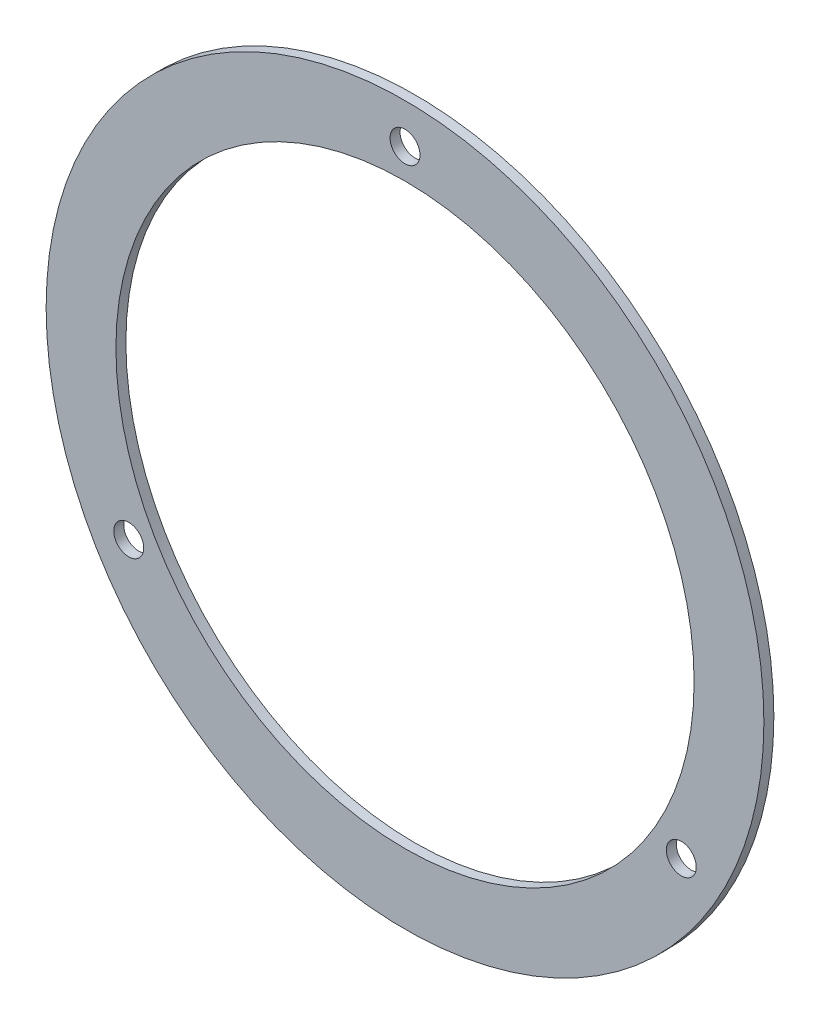
ISO-10303-21;
HEADER;
FILE_DESCRIPTION(('STEP AP214'),'2;1');
FILE_NAME('part.step','',(''),(''),'','','');
FILE_SCHEMA(('AUTOMOTIVE_DESIGN { 1 0 10303 214 1 1 1 1 }'));
ENDSEC;
DATA;
#1=APPLICATION_CONTEXT('core data for automotive mechanical design processes');
#2=APPLICATION_PROTOCOL_DEFINITION('international standard','automotive_design',2000,#1);
#3=PRODUCT_CONTEXT('',#1,'mechanical');
#4=PRODUCT('Part','Part','',(#3));
#5=PRODUCT_RELATED_PRODUCT_CATEGORY('part','',(#4));
#6=PRODUCT_DEFINITION_FORMATION('','',#4);
#7=PRODUCT_DEFINITION_CONTEXT('part definition',#1,'design');
#8=PRODUCT_DEFINITION('design','',#6,#7);
#9=PRODUCT_DEFINITION_SHAPE('','',#8);
#10=(LENGTH_UNIT() NAMED_UNIT(*) SI_UNIT(.MILLI.,.METRE.));
#11=(NAMED_UNIT(*) PLANE_ANGLE_UNIT() SI_UNIT($,.RADIAN.));
#12=(NAMED_UNIT(*) SI_UNIT($,.STERADIAN.) SOLID_ANGLE_UNIT());
#13=UNCERTAINTY_MEASURE_WITH_UNIT(LENGTH_MEASURE(1.E-05),#10,'distance_accuracy_value','');
#14=(GEOMETRIC_REPRESENTATION_CONTEXT(3) GLOBAL_UNCERTAINTY_ASSIGNED_CONTEXT((#13)) GLOBAL_UNIT_ASSIGNED_CONTEXT((#10,
#11,#12)) REPRESENTATION_CONTEXT('',''));
#15=CARTESIAN_POINT('',(0.,0.,0.));
#16=DIRECTION('',(0.,0.,1.));
#17=DIRECTION('',(1.,0.,0.));
#18=AXIS2_PLACEMENT_3D('',#15,#16,#17);
#19=CARTESIAN_POINT('',(0.,0.,1.));
#20=DIRECTION('',(0.,0.,1.));
#21=DIRECTION('',(1.,0.,0.));
#22=AXIS2_PLACEMENT_3D('',#19,#20,#21);
#23=PLANE('',#22);
#24=CARTESIAN_POINT('',(27.7128129211019,-16.,1.));
#25=DIRECTION('',(0.,0.,1.));
#26=DIRECTION('',(1.,0.,0.));
#27=AXIS2_PLACEMENT_3D('',#24,#25,#26);
#28=CIRCLE('',#27,1.5);
#29=CARTESIAN_POINT('',(29.212812921102,-16.,1.));
#30=VERTEX_POINT('',#29);
#31=EDGE_CURVE('E37',#30,#30,#28,.T.);
#32=ORIENTED_EDGE('',*,*,#31,.F.);
#33=EDGE_LOOP('',(#32));
#34=FACE_BOUND('',#33,.T.);
#35=CARTESIAN_POINT('',(0.,0.,1.));
#36=DIRECTION('',(0.,0.,1.));
#37=DIRECTION('',(1.,0.,0.));
#38=AXIS2_PLACEMENT_3D('',#35,#36,#37);
#39=CIRCLE('',#38,29.);
#40=CARTESIAN_POINT('',(29.,0.,1.));
#41=VERTEX_POINT('',#40);
#42=EDGE_CURVE('E26',#41,#41,#39,.T.);
#43=ORIENTED_EDGE('',*,*,#42,.F.);
#44=EDGE_LOOP('',(#43));
#45=FACE_BOUND('',#44,.T.);
#46=CARTESIAN_POINT('',(0.,0.,1.));
#47=DIRECTION('',(0.,0.,1.));
#48=DIRECTION('',(1.,0.,0.));
#49=AXIS2_PLACEMENT_3D('',#46,#47,#48);
#50=CIRCLE('',#49,36.);
#51=CARTESIAN_POINT('',(36.,0.,1.));
#52=VERTEX_POINT('',#51);
#53=EDGE_CURVE('E10',#52,#52,#50,.T.);
#54=ORIENTED_EDGE('',*,*,#53,.T.);
#55=EDGE_LOOP('',(#54));
#56=FACE_BOUND('',#55,.T.);
#57=CARTESIAN_POINT('',(0.,32.,1.));
#58=DIRECTION('',(0.,0.,1.));
#59=DIRECTION('',(1.,0.,0.));
#60=AXIS2_PLACEMENT_3D('',#57,#58,#59);
#61=CIRCLE('',#60,1.5);
#62=CARTESIAN_POINT('',(1.5,32.,1.));
#63=VERTEX_POINT('',#62);
#64=EDGE_CURVE('E31',#63,#63,#61,.T.);
#65=ORIENTED_EDGE('',*,*,#64,.F.);
#66=EDGE_LOOP('',(#65));
#67=FACE_BOUND('',#66,.T.);
#68=CARTESIAN_POINT('',(-27.7128129211019,-16.,1.));
#69=DIRECTION('',(0.,0.,1.));
#70=DIRECTION('',(1.,0.,0.));
#71=AXIS2_PLACEMENT_3D('',#68,#69,#70);
#72=CIRCLE('',#71,1.5);
#73=CARTESIAN_POINT('',(-26.2128129211019,-16.,1.));
#74=VERTEX_POINT('',#73);
#75=EDGE_CURVE('E43',#74,#74,#72,.T.);
#76=ORIENTED_EDGE('',*,*,#75,.F.);
#77=EDGE_LOOP('',(#76));
#78=FACE_BOUND('',#77,.T.);
#79=ADVANCED_FACE('F15',(#34,#45,#56,#67,#78),#23,.T.);
#80=CARTESIAN_POINT('',(0.,0.,0.));
#81=DIRECTION('',(0.,0.,1.));
#82=DIRECTION('',(1.,0.,0.));
#83=AXIS2_PLACEMENT_3D('',#80,#81,#82);
#84=PLANE('',#83);
#85=CARTESIAN_POINT('',(0.,0.,0.));
#86=DIRECTION('',(0.,0.,1.));
#87=DIRECTION('',(1.,0.,0.));
#88=AXIS2_PLACEMENT_3D('',#85,#86,#87);
#89=CIRCLE('',#88,36.);
#90=CARTESIAN_POINT('',(36.,0.,0.));
#91=VERTEX_POINT('',#90);
#92=EDGE_CURVE('E19',#91,#91,#89,.T.);
#93=ORIENTED_EDGE('',*,*,#92,.F.);
#94=EDGE_LOOP('',(#93));
#95=FACE_BOUND('',#94,.T.);
#96=CARTESIAN_POINT('',(0.,0.,0.));
#97=DIRECTION('',(0.,0.,1.));
#98=DIRECTION('',(1.,0.,0.));
#99=AXIS2_PLACEMENT_3D('',#96,#97,#98);
#100=CIRCLE('',#99,29.);
#101=CARTESIAN_POINT('',(29.,0.,0.));
#102=VERTEX_POINT('',#101);
#103=EDGE_CURVE('E28',#102,#102,#100,.T.);
#104=ORIENTED_EDGE('',*,*,#103,.T.);
#105=EDGE_LOOP('',(#104));
#106=FACE_BOUND('',#105,.T.);
#107=CARTESIAN_POINT('',(0.,32.,0.));
#108=DIRECTION('',(0.,0.,1.));
#109=DIRECTION('',(1.,0.,0.));
#110=AXIS2_PLACEMENT_3D('',#107,#108,#109);
#111=CIRCLE('',#110,1.5);
#112=CARTESIAN_POINT('',(1.5,32.,0.));
#113=VERTEX_POINT('',#112);
#114=EDGE_CURVE('E34',#113,#113,#111,.T.);
#115=ORIENTED_EDGE('',*,*,#114,.T.);
#116=EDGE_LOOP('',(#115));
#117=FACE_BOUND('',#116,.T.);
#118=CARTESIAN_POINT('',(27.7128129211019,-16.,0.));
#119=DIRECTION('',(0.,0.,1.));
#120=DIRECTION('',(1.,0.,0.));
#121=AXIS2_PLACEMENT_3D('',#118,#119,#120);
#122=CIRCLE('',#121,1.5);
#123=CARTESIAN_POINT('',(29.212812921102,-16.,0.));
#124=VERTEX_POINT('',#123);
#125=EDGE_CURVE('E40',#124,#124,#122,.T.);
#126=ORIENTED_EDGE('',*,*,#125,.T.);
#127=EDGE_LOOP('',(#126));
#128=FACE_BOUND('',#127,.T.);
#129=CARTESIAN_POINT('',(-27.7128129211019,-16.,0.));
#130=DIRECTION('',(0.,0.,1.));
#131=DIRECTION('',(1.,0.,0.));
#132=AXIS2_PLACEMENT_3D('',#129,#130,#131);
#133=CIRCLE('',#132,1.5);
#134=CARTESIAN_POINT('',(-26.2128129211019,-16.,0.));
#135=VERTEX_POINT('',#134);
#136=EDGE_CURVE('E46',#135,#135,#133,.T.);
#137=ORIENTED_EDGE('',*,*,#136,.T.);
#138=EDGE_LOOP('',(#137));
#139=FACE_BOUND('',#138,.T.);
#140=ADVANCED_FACE('F56',(#95,#106,#117,#128,#139),#84,.F.);
#141=CARTESIAN_POINT('',(0.,0.,1.));
#142=DIRECTION('',(0.,0.,-1.));
#143=DIRECTION('',(-1.,0.,0.));
#144=AXIS2_PLACEMENT_3D('',#141,#142,#143);
#145=CYLINDRICAL_SURFACE('',#144,36.);
#146=ORIENTED_EDGE('',*,*,#53,.F.);
#147=EDGE_LOOP('',(#146));
#148=FACE_BOUND('',#147,.T.);
#149=ORIENTED_EDGE('',*,*,#92,.T.);
#150=EDGE_LOOP('',(#149));
#151=FACE_BOUND('',#150,.T.);
#152=ADVANCED_FACE('F17',(#148,#151),#145,.T.);
#153=CARTESIAN_POINT('',(0.,0.,1.));
#154=DIRECTION('',(0.,0.,-1.));
#155=DIRECTION('',(-1.,0.,0.));
#156=AXIS2_PLACEMENT_3D('',#153,#154,#155);
#157=CYLINDRICAL_SURFACE('',#156,29.);
#158=ORIENTED_EDGE('',*,*,#42,.T.);
#159=EDGE_LOOP('',(#158));
#160=FACE_BOUND('',#159,.T.);
#161=ORIENTED_EDGE('',*,*,#103,.F.);
#162=EDGE_LOOP('',(#161));
#163=FACE_BOUND('',#162,.T.);
#164=ADVANCED_FACE('F68',(#160,#163),#157,.F.);
#165=CARTESIAN_POINT('',(0.,32.,1.));
#166=DIRECTION('',(0.,0.,-1.));
#167=DIRECTION('',(-1.,0.,0.));
#168=AXIS2_PLACEMENT_3D('',#165,#166,#167);
#169=CYLINDRICAL_SURFACE('',#168,1.5);
#170=ORIENTED_EDGE('',*,*,#64,.T.);
#171=EDGE_LOOP('',(#170));
#172=FACE_BOUND('',#171,.T.);
#173=ORIENTED_EDGE('',*,*,#114,.F.);
#174=EDGE_LOOP('',(#173));
#175=FACE_BOUND('',#174,.T.);
#176=ADVANCED_FACE('F71',(#172,#175),#169,.F.);
#177=CARTESIAN_POINT('',(27.7128129211019,-16.,1.));
#178=DIRECTION('',(0.,0.,-1.));
#179=DIRECTION('',(-1.,0.,0.));
#180=AXIS2_PLACEMENT_3D('',#177,#178,#179);
#181=CYLINDRICAL_SURFACE('',#180,1.5);
#182=ORIENTED_EDGE('',*,*,#31,.T.);
#183=EDGE_LOOP('',(#182));
#184=FACE_BOUND('',#183,.T.);
#185=ORIENTED_EDGE('',*,*,#125,.F.);
#186=EDGE_LOOP('',(#185));
#187=FACE_BOUND('',#186,.T.);
#188=ADVANCED_FACE('F75',(#184,#187),#181,.F.);
#189=CARTESIAN_POINT('',(-27.7128129211019,-16.,1.));
#190=DIRECTION('',(0.,0.,-1.));
#191=DIRECTION('',(-1.,0.,0.));
#192=AXIS2_PLACEMENT_3D('',#189,#190,#191);
#193=CYLINDRICAL_SURFACE('',#192,1.5);
#194=ORIENTED_EDGE('',*,*,#75,.T.);
#195=EDGE_LOOP('',(#194));
#196=FACE_BOUND('',#195,.T.);
#197=ORIENTED_EDGE('',*,*,#136,.F.);
#198=EDGE_LOOP('',(#197));
#199=FACE_BOUND('',#198,.T.);
#200=ADVANCED_FACE('F52',(#196,#199),#193,.F.);
#201=CLOSED_SHELL('',(#79,#140,#152,#164,#176,#188,#200));
#202=MANIFOLD_SOLID_BREP('B1',#201);
#203=ADVANCED_BREP_SHAPE_REPRESENTATION('',(#18,#202),#14);
#204=SHAPE_DEFINITION_REPRESENTATION(#9,#203);
ENDSEC;
END-ISO-10303-21;
